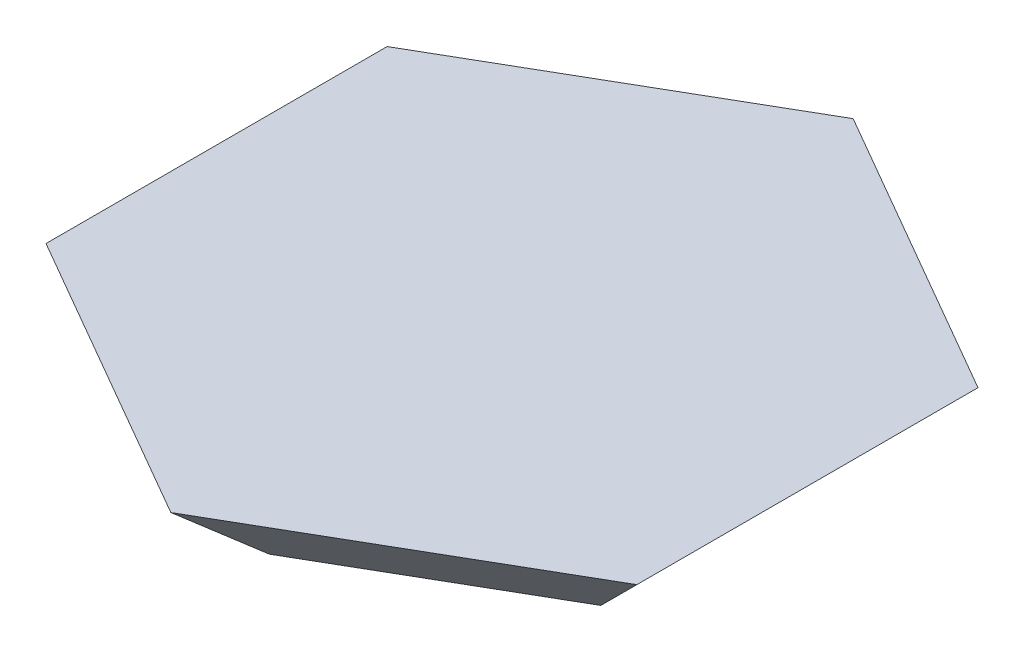
ISO-10303-21;
HEADER;
FILE_DESCRIPTION(('STEP AP214'),'2;1');
FILE_NAME('part.step','',(''),(''),'','','');
FILE_SCHEMA(('AUTOMOTIVE_DESIGN { 1 0 10303 214 1 1 1 1 }'));
ENDSEC;
DATA;
#1=APPLICATION_CONTEXT('core data for automotive mechanical design processes');
#2=APPLICATION_PROTOCOL_DEFINITION('international standard','automotive_design',2000,#1);
#3=PRODUCT_CONTEXT('',#1,'mechanical');
#4=PRODUCT('Part','Part','',(#3));
#5=PRODUCT_RELATED_PRODUCT_CATEGORY('part','',(#4));
#6=PRODUCT_DEFINITION_FORMATION('','',#4);
#7=PRODUCT_DEFINITION_CONTEXT('part definition',#1,'design');
#8=PRODUCT_DEFINITION('design','',#6,#7);
#9=PRODUCT_DEFINITION_SHAPE('','',#8);
#10=(LENGTH_UNIT() NAMED_UNIT(*) SI_UNIT(.MILLI.,.METRE.));
#11=(NAMED_UNIT(*) PLANE_ANGLE_UNIT() SI_UNIT($,.RADIAN.));
#12=(NAMED_UNIT(*) SI_UNIT($,.STERADIAN.) SOLID_ANGLE_UNIT());
#13=UNCERTAINTY_MEASURE_WITH_UNIT(LENGTH_MEASURE(1.E-05),#10,'distance_accuracy_value','');
#14=(GEOMETRIC_REPRESENTATION_CONTEXT(3) GLOBAL_UNCERTAINTY_ASSIGNED_CONTEXT((#13)) GLOBAL_UNIT_ASSIGNED_CONTEXT((#10,
#11,#12)) REPRESENTATION_CONTEXT('',''));
#15=CARTESIAN_POINT('',(0.,0.,0.));
#16=DIRECTION('',(0.,0.,1.));
#17=DIRECTION('',(1.,0.,0.));
#18=AXIS2_PLACEMENT_3D('',#15,#16,#17);
#19=CARTESIAN_POINT('',(0.,-130.,0.));
#20=DIRECTION('',(0.,1.,0.));
#21=DIRECTION('',(0.,0.,1.));
#22=AXIS2_PLACEMENT_3D('',#19,#20,#21);
#23=PLANE('',#22);
#24=DIRECTION('',(-0.866025403784442,0.,-0.499999999999995));
#25=VECTOR('',#24,1.);
#26=CARTESIAN_POINT('',(-88.9230484541322,-130.,34.0192378864669));
#27=LINE('',#26,#25);
#28=CARTESIAN_POINT('',(5.79741931923201E-13,-130.,85.358983848622));
#29=VERTEX_POINT('',#28);
#30=CARTESIAN_POINT('',(-73.923048454132,-130.,42.6794919243113));
#31=VERTEX_POINT('',#30);
#32=EDGE_CURVE('E177',#29,#31,#27,.T.);
#33=ORIENTED_EDGE('',*,*,#32,.T.);
#34=DIRECTION('',(0.,0.,-1.));
#35=VECTOR('',#34,1.);
#36=CARTESIAN_POINT('',(-73.9230484541324,-130.,-59.9999999999997));
#37=LINE('',#36,#35);
#38=CARTESIAN_POINT('',(-73.9230484541323,-130.,-42.6794919243108));
#39=VERTEX_POINT('',#38);
#40=EDGE_CURVE('E168',#31,#39,#37,.T.);
#41=ORIENTED_EDGE('',*,*,#40,.T.);
#42=DIRECTION('',(0.866025403784438,0.,-0.500000000000001));
#43=VECTOR('',#42,1.);
#44=CARTESIAN_POINT('',(15.0000000000001,-130.,-94.0192378864664));
#45=LINE('',#44,#43);
#46=CARTESIAN_POINT('',(1.49828066620117E-13,-130.,-85.358983848622));
#47=VERTEX_POINT('',#46);
#48=EDGE_CURVE('E196',#39,#47,#45,.T.);
#49=ORIENTED_EDGE('',*,*,#48,.T.);
#50=DIRECTION('',(0.866025403784441,0.,0.499999999999995));
#51=VECTOR('',#50,1.);
#52=CARTESIAN_POINT('',(88.9230484541318,-130.,-34.0192378864677));
#53=LINE('',#52,#51);
#54=CARTESIAN_POINT('',(73.9230484541317,-130.,-42.679491924312));
#55=VERTEX_POINT('',#54);
#56=EDGE_CURVE('E193',#47,#55,#53,.T.);
#57=ORIENTED_EDGE('',*,*,#56,.T.);
#58=DIRECTION('',(0.,0.,1.));
#59=VECTOR('',#58,1.);
#60=CARTESIAN_POINT('',(73.9230484541328,-130.,59.9999999999992));
#61=LINE('',#60,#59);
#62=CARTESIAN_POINT('',(73.9230484541326,-130.,42.6794919243103));
#63=VERTEX_POINT('',#62);
#64=EDGE_CURVE('E190',#55,#63,#61,.T.);
#65=ORIENTED_EDGE('',*,*,#64,.T.);
#66=DIRECTION('',(-0.866025403784435,0.,0.500000000000007));
#67=VECTOR('',#66,1.);
#68=CARTESIAN_POINT('',(-14.9999999999995,-130.,94.0192378864665));
#69=LINE('',#68,#67);
#70=EDGE_CURVE('E182',#63,#29,#69,.T.);
#71=ORIENTED_EDGE('',*,*,#70,.T.);
#72=EDGE_LOOP('',(#33,#41,#49,#57,#65,#71));
#73=FACE_BOUND('',#72,.T.);
#74=ADVANCED_FACE('F45',(#73),#23,.F.);
#75=CARTESIAN_POINT('',(103.923048454133,-99.9999999999998,59.9999999999989));
#76=DIRECTION('',(0.707106781186547,-0.707106781186548,0.));
#77=DIRECTION('',(0.,0.,1.));
#78=AXIS2_PLACEMENT_3D('',#75,#76,#77);
#79=PLANE('',#78);
#80=DIRECTION('',(0.654653670707981,0.654653670707977,0.377964473009221));
#81=VECTOR('',#80,1.);
#82=CARTESIAN_POINT('',(74.2307488958091,-129.692299558323,42.857142857142));
#83=LINE('',#82,#81);
#84=CARTESIAN_POINT('',(103.923048454133,-99.9999999999999,59.9999999999989));
#85=VERTEX_POINT('',#84);
#86=EDGE_CURVE('E185',#63,#85,#83,.T.);
#87=ORIENTED_EDGE('',*,*,#86,.F.);
#88=ORIENTED_EDGE('',*,*,#64,.F.);
#89=DIRECTION('',(0.654653670707974,0.654653670707978,-0.377964473009232));
#90=VECTOR('',#89,1.);
#91=CARTESIAN_POINT('',(74.2307488958084,-129.692299558323,-42.8571428571438));
#92=LINE('',#91,#90);
#93=CARTESIAN_POINT('',(103.923048454132,-99.9999999999998,-60.0000000000011));
#94=VERTEX_POINT('',#93);
#95=EDGE_CURVE('E178',#94,#55,#92,.F.);
#96=ORIENTED_EDGE('',*,*,#95,.F.);
#97=DIRECTION('',(0.,0.,-1.));
#98=VECTOR('',#97,1.);
#99=CARTESIAN_POINT('',(103.923048454132,-99.9999999999998,-60.0000000000011));
#100=LINE('',#99,#98);
#101=EDGE_CURVE('E119',#85,#94,#100,.T.);
#102=ORIENTED_EDGE('',*,*,#101,.F.);
#103=EDGE_LOOP('',(#87,#88,#96,#102));
#104=FACE_BOUND('',#103,.T.);
#105=ADVANCED_FACE('F308',(#104),#79,.T.);
#106=CARTESIAN_POINT('',(103.923048454132,-99.9999999999998,-60.0000000000011));
#107=DIRECTION('',(0.35355339059327,-0.707106781186547,-0.612372435695796));
#108=DIRECTION('',(0.866025403784442,0.,0.499999999999995));
#109=AXIS2_PLACEMENT_3D('',#106,#107,#108);
#110=PLANE('',#109);
#111=ORIENTED_EDGE('',*,*,#95,.T.);
#112=ORIENTED_EDGE('',*,*,#56,.F.);
#113=DIRECTION('',(0.,0.654653670707977,-0.755928946018454));
#114=VECTOR('',#113,1.);
#115=CARTESIAN_POINT('',(1.52655665885959E-13,-129.692299558323,-85.714285714286));
#116=LINE('',#115,#114);
#117=CARTESIAN_POINT('',(0.,-99.9999999999998,-120.));
#118=VERTEX_POINT('',#117);
#119=EDGE_CURVE('E214',#118,#47,#116,.F.);
#120=ORIENTED_EDGE('',*,*,#119,.F.);
#121=DIRECTION('',(-0.866025403784442,0.,-0.499999999999995));
#122=VECTOR('',#121,1.);
#123=CARTESIAN_POINT('',(0.,-99.9999999999998,-120.));
#124=LINE('',#123,#122);
#125=EDGE_CURVE('E203',#94,#118,#124,.T.);
#126=ORIENTED_EDGE('',*,*,#125,.F.);
#127=EDGE_LOOP('',(#111,#112,#120,#126));
#128=FACE_BOUND('',#127,.T.);
#129=ADVANCED_FACE('F379',(#128),#110,.T.);
#130=CARTESIAN_POINT('',(8.3795552132235E-13,-99.9999999999998,120.));
#131=DIRECTION('',(0.353553390593279,-0.707106781186548,0.612372435695791));
#132=DIRECTION('',(-0.866025403784435,0.,0.500000000000007));
#133=AXIS2_PLACEMENT_3D('',#130,#131,#132);
#134=PLANE('',#133);
#135=ORIENTED_EDGE('',*,*,#86,.T.);
#136=DIRECTION('',(0.866025403784435,0.,-0.500000000000007));
#137=VECTOR('',#136,1.);
#138=CARTESIAN_POINT('',(103.923048454133,-99.9999999999999,59.9999999999989));
#139=LINE('',#138,#137);
#140=CARTESIAN_POINT('',(8.3795552132235E-13,-99.9999999999998,120.));
#141=VERTEX_POINT('',#140);
#142=EDGE_CURVE('E111',#141,#85,#139,.T.);
#143=ORIENTED_EDGE('',*,*,#142,.F.);
#144=DIRECTION('',(0.,0.654653670707977,0.755928946018455));
#145=VECTOR('',#144,1.);
#146=CARTESIAN_POINT('',(5.82867087928207E-13,-129.692299558323,85.7142857142853));
#147=LINE('',#146,#145);
#148=EDGE_CURVE('E156',#29,#141,#147,.T.);
#149=ORIENTED_EDGE('',*,*,#148,.F.);
#150=ORIENTED_EDGE('',*,*,#70,.F.);
#151=EDGE_LOOP('',(#135,#143,#149,#150));
#152=FACE_BOUND('',#151,.T.);
#153=ADVANCED_FACE('F371',(#152),#134,.T.);
#154=CARTESIAN_POINT('',(0.,-99.9999999999998,-120.));
#155=DIRECTION('',(-0.353553390593274,-0.707106781186548,-0.612372435695794));
#156=DIRECTION('',(0.866025403784438,0.,-0.500000000000001));
#157=AXIS2_PLACEMENT_3D('',#154,#155,#156);
#158=PLANE('',#157);
#159=ORIENTED_EDGE('',*,*,#119,.T.);
#160=ORIENTED_EDGE('',*,*,#48,.F.);
#161=DIRECTION('',(-0.654653670707978,0.654653670707977,-0.377964473009226));
#162=VECTOR('',#161,1.);
#163=CARTESIAN_POINT('',(-74.2307488958089,-129.692299558323,-42.8571428571425));
#164=LINE('',#163,#162);
#165=CARTESIAN_POINT('',(-103.923048454133,-99.9999999999998,-59.9999999999996));
#166=VERTEX_POINT('',#165);
#167=EDGE_CURVE('E170',#166,#39,#164,.F.);
#168=ORIENTED_EDGE('',*,*,#167,.F.);
#169=DIRECTION('',(-0.866025403784438,0.,0.500000000000001));
#170=VECTOR('',#169,1.);
#171=CARTESIAN_POINT('',(-103.923048454133,-99.9999999999998,-59.9999999999996));
#172=LINE('',#171,#170);
#173=EDGE_CURVE('E175',#118,#166,#172,.T.);
#174=ORIENTED_EDGE('',*,*,#173,.F.);
#175=EDGE_LOOP('',(#159,#160,#168,#174));
#176=FACE_BOUND('',#175,.T.);
#177=ADVANCED_FACE('F364',(#176),#158,.T.);
#178=CARTESIAN_POINT('',(-103.923048454132,-99.9999999999998,60.0000000000003));
#179=DIRECTION('',(-0.35355339059327,-0.707106781186548,0.612372435695796));
#180=DIRECTION('',(-0.866025403784442,0.,-0.499999999999995));
#181=AXIS2_PLACEMENT_3D('',#178,#179,#180);
#182=PLANE('',#181);
#183=ORIENTED_EDGE('',*,*,#148,.T.);
#184=DIRECTION('',(0.866025403784442,0.,0.499999999999995));
#185=VECTOR('',#184,1.);
#186=CARTESIAN_POINT('',(8.36526585625329E-13,-99.9999999999998,120.));
#187=LINE('',#186,#185);
#188=CARTESIAN_POINT('',(-103.923048454132,-99.9999999999998,60.0000000000003));
#189=VERTEX_POINT('',#188);
#190=EDGE_CURVE('E151',#189,#141,#187,.T.);
#191=ORIENTED_EDGE('',*,*,#190,.F.);
#192=DIRECTION('',(0.654653670707976,-0.654653670707977,-0.37796447300923));
#193=VECTOR('',#192,1.);
#194=CARTESIAN_POINT('',(-103.923048454132,-99.9999999999998,60.0000000000003));
#195=LINE('',#194,#193);
#196=EDGE_CURVE('E155',#31,#189,#195,.F.);
#197=ORIENTED_EDGE('',*,*,#196,.F.);
#198=ORIENTED_EDGE('',*,*,#32,.F.);
#199=EDGE_LOOP('',(#183,#191,#197,#198));
#200=FACE_BOUND('',#199,.T.);
#201=ADVANCED_FACE('F153',(#200),#182,.T.);
#202=CARTESIAN_POINT('',(-103.923048454133,-99.9999999999998,-59.9999999999996));
#203=DIRECTION('',(-0.707106781186547,-0.707106781186548,0.));
#204=DIRECTION('',(0.,0.,-1.));
#205=AXIS2_PLACEMENT_3D('',#202,#203,#204);
#206=PLANE('',#205);
#207=ORIENTED_EDGE('',*,*,#167,.T.);
#208=ORIENTED_EDGE('',*,*,#40,.F.);
#209=ORIENTED_EDGE('',*,*,#196,.T.);
#210=DIRECTION('',(0.,0.,1.));
#211=VECTOR('',#210,1.);
#212=CARTESIAN_POINT('',(-103.923048454132,-99.9999999999998,60.0000000000004));
#213=LINE('',#212,#211);
#214=EDGE_CURVE('E165',#166,#189,#213,.T.);
#215=ORIENTED_EDGE('',*,*,#214,.F.);
#216=EDGE_LOOP('',(#207,#208,#209,#215));
#217=FACE_BOUND('',#216,.T.);
#218=ADVANCED_FACE('F164',(#217),#206,.T.);
#219=CARTESIAN_POINT('',(0.,-100.,0.));
#220=DIRECTION('',(0.,1.,0.));
#221=DIRECTION('',(0.,0.,1.));
#222=AXIS2_PLACEMENT_3D('',#219,#220,#221);
#223=PLANE('',#222);
#224=ORIENTED_EDGE('',*,*,#101,.T.);
#225=ORIENTED_EDGE('',*,*,#125,.T.);
#226=ORIENTED_EDGE('',*,*,#173,.T.);
#227=ORIENTED_EDGE('',*,*,#214,.T.);
#228=ORIENTED_EDGE('',*,*,#190,.T.);
#229=ORIENTED_EDGE('',*,*,#142,.T.);
#230=EDGE_LOOP('',(#224,#225,#226,#227,#228,#229));
#231=FACE_BOUND('',#230,.T.);
#232=ADVANCED_FACE('F172',(#231),#223,.T.);
#233=CLOSED_SHELL('',(#74,#105,#129,#153,#177,#201,#218,#232));
#234=CARTESIAN_POINT('',(0.,-120.,0.));
#235=DIRECTION('',(0.,1.,0.));
#236=DIRECTION('',(0.,0.,1.));
#237=AXIS2_PLACEMENT_3D('',#234,#235,#236);
#238=PLANE('',#237);
#239=DIRECTION('',(-0.866025403784441,0.,-0.499999999999995));
#240=VECTOR('',#239,1.);
#241=CARTESIAN_POINT('',(-86.8519806422668,-120.,30.4320432103954));
#242=LINE('',#241,#240);
#243=CARTESIAN_POINT('',(5.49695639948458E-13,-120.,80.57605761386));
#244=VERTEX_POINT('',#243);
#245=CARTESIAN_POINT('',(-69.7809128304011,-120.,40.2880288069303));
#246=VERTEX_POINT('',#245);
#247=EDGE_CURVE('E49',#244,#246,#242,.T.);
#248=ORIENTED_EDGE('',*,*,#247,.F.);
#249=DIRECTION('',(-0.866025403784434,0.,0.500000000000007));
#250=VECTOR('',#249,1.);
#251=CARTESIAN_POINT('',(-17.071067811865,-120.,90.4320432103951));
#252=LINE('',#251,#250);
#253=CARTESIAN_POINT('',(69.7809128304016,-120.,40.2880288069294));
#254=VERTEX_POINT('',#253);
#255=EDGE_CURVE('E259',#254,#244,#252,.T.);
#256=ORIENTED_EDGE('',*,*,#255,.F.);
#257=DIRECTION('',(0.,0.,1.));
#258=VECTOR('',#257,1.);
#259=CARTESIAN_POINT('',(69.7809128304018,-120.,59.9999999999993));
#260=LINE('',#259,#258);
#261=CARTESIAN_POINT('',(69.7809128304008,-120.,-40.288028806931));
#262=VERTEX_POINT('',#261);
#263=EDGE_CURVE('E262',#262,#254,#260,.T.);
#264=ORIENTED_EDGE('',*,*,#263,.F.);
#265=DIRECTION('',(0.866025403784441,0.,0.499999999999995));
#266=VECTOR('',#265,1.);
#267=CARTESIAN_POINT('',(86.8519806422663,-120.,-30.4320432103962));
#268=LINE('',#267,#266);
#269=CARTESIAN_POINT('',(1.65852755673314E-13,-120.,-80.5760576138601));
#270=VERTEX_POINT('',#269);
#271=EDGE_CURVE('E265',#270,#262,#268,.T.);
#272=ORIENTED_EDGE('',*,*,#271,.F.);
#273=DIRECTION('',(0.866025403784438,0.,-0.500000000000001));
#274=VECTOR('',#273,1.);
#275=CARTESIAN_POINT('',(17.0710678118656,-120.,-90.4320432103949));
#276=LINE('',#275,#274);
#277=CARTESIAN_POINT('',(-69.7809128304013,-120.,-40.2880288069298));
#278=VERTEX_POINT('',#277);
#279=EDGE_CURVE('E97',#278,#270,#276,.T.);
#280=ORIENTED_EDGE('',*,*,#279,.F.);
#281=DIRECTION('',(0.,0.,-1.));
#282=VECTOR('',#281,1.);
#283=CARTESIAN_POINT('',(-69.7809128304014,-120.,-59.9999999999997));
#284=LINE('',#283,#282);
#285=EDGE_CURVE('E269',#246,#278,#284,.T.);
#286=ORIENTED_EDGE('',*,*,#285,.F.);
#287=EDGE_LOOP('',(#248,#256,#264,#272,#280,#286));
#288=FACE_BOUND('',#287,.T.);
#289=ADVANCED_FACE('F278',(#288),#238,.T.);
#290=CARTESIAN_POINT('',(96.8519806422675,-92.9289321881344,59.999999999999));
#291=DIRECTION('',(0.707106781186547,-0.707106781186548,0.));
#292=DIRECTION('',(0.,0.,1.));
#293=AXIS2_PLACEMENT_3D('',#290,#291,#292);
#294=PLANE('',#293);
#295=DIRECTION('',(0.654653670707981,0.654653670707977,0.377964473009221));
#296=VECTOR('',#295,1.);
#297=CARTESIAN_POINT('',(68.1698336284958,-121.611079201906,39.3578717960232));
#298=LINE('',#297,#296);
#299=CARTESIAN_POINT('',(79.7809128304017,-110.,46.0615314988255));
#300=VERTEX_POINT('',#299);
#301=EDGE_CURVE('E251',#254,#300,#298,.T.);
#302=ORIENTED_EDGE('',*,*,#301,.T.);
#303=DIRECTION('',(0.,0.,-1.));
#304=VECTOR('',#303,1.);
#305=CARTESIAN_POINT('',(79.7809128304012,-110.,-8.30386934530538E-13));
#306=LINE('',#305,#304);
#307=CARTESIAN_POINT('',(79.7809128304007,-110.,-46.0615314988273));
#308=VERTEX_POINT('',#307);
#309=EDGE_CURVE('E234',#300,#308,#306,.T.);
#310=ORIENTED_EDGE('',*,*,#309,.T.);
#311=DIRECTION('',(-0.654653670707974,-0.654653670707977,0.377964473009232));
#312=VECTOR('',#311,1.);
#313=CARTESIAN_POINT('',(97.8621331868185,-91.9187796435822,-56.5007289388822));
#314=LINE('',#313,#312);
#315=EDGE_CURVE('E255',#308,#262,#314,.T.);
#316=ORIENTED_EDGE('',*,*,#315,.T.);
#317=ORIENTED_EDGE('',*,*,#263,.T.);
#318=EDGE_LOOP('',(#302,#310,#316,#317));
#319=FACE_BOUND('',#318,.T.);
#320=ADVANCED_FACE('F298',(#319),#294,.F.);
#321=CARTESIAN_POINT('',(100.387514548199,-92.9289321881344,-53.8762756430431));
#322=DIRECTION('',(0.35355339059327,-0.707106781186547,-0.612372435695796));
#323=DIRECTION('',(0.866025403784442,0.,0.499999999999995));
#324=AXIS2_PLACEMENT_3D('',#321,#322,#323);
#325=PLANE('',#324);
#326=ORIENTED_EDGE('',*,*,#315,.F.);
#327=DIRECTION('',(-0.866025403784441,0.,-0.499999999999995));
#328=VECTOR('',#327,1.);
#329=CARTESIAN_POINT('',(39.8904564152004,-110.,-69.0922972482399));
#330=LINE('',#329,#328);
#331=CARTESIAN_POINT('',(1.12172823372375E-13,-110.,-92.1230629976526));
#332=VERTEX_POINT('',#331);
#333=EDGE_CURVE('E230',#308,#332,#330,.T.);
#334=ORIENTED_EDGE('',*,*,#333,.T.);
#335=DIRECTION('',(0.,-0.654653670707977,0.755928946018454));
#336=VECTOR('',#335,1.);
#337=CARTESIAN_POINT('',(0.,-91.9187796435822,-113.001457877762));
#338=LINE('',#337,#336);
#339=EDGE_CURVE('E247',#332,#270,#338,.T.);
#340=ORIENTED_EDGE('',*,*,#339,.T.);
#341=ORIENTED_EDGE('',*,*,#271,.T.);
#342=EDGE_LOOP('',(#326,#334,#340,#341));
#343=FACE_BOUND('',#342,.T.);
#344=ADVANCED_FACE('F282',(#343),#325,.F.);
#345=CARTESIAN_POINT('',(-3.53553390593195,-92.9289321881344,113.876275643042));
#346=DIRECTION('',(0.353553390593279,-0.707106781186548,0.612372435695791));
#347=DIRECTION('',(-0.866025403784435,0.,0.500000000000007));
#348=AXIS2_PLACEMENT_3D('',#345,#346,#347);
#349=PLANE('',#348);
#350=ORIENTED_EDGE('',*,*,#301,.F.);
#351=ORIENTED_EDGE('',*,*,#255,.T.);
#352=DIRECTION('',(0.,0.654653670707977,0.755928946018455));
#353=VECTOR('',#352,1.);
#354=CARTESIAN_POINT('',(5.27355936696949E-13,-121.611079201906,78.7157435920477));
#355=LINE('',#354,#353);
#356=CARTESIAN_POINT('',(6.44457401005003E-13,-110.,92.1230629976525));
#357=VERTEX_POINT('',#356);
#358=EDGE_CURVE('E243',#244,#357,#355,.T.);
#359=ORIENTED_EDGE('',*,*,#358,.T.);
#360=DIRECTION('',(0.866025403784434,0.,-0.500000000000007));
#361=VECTOR('',#360,1.);
#362=CARTESIAN_POINT('',(39.8904564152012,-110.,69.092297248239));
#363=LINE('',#362,#361);
#364=EDGE_CURVE('E12',#357,#300,#363,.T.);
#365=ORIENTED_EDGE('',*,*,#364,.T.);
#366=EDGE_LOOP('',(#350,#351,#359,#365));
#367=FACE_BOUND('',#366,.T.);
#368=ADVANCED_FACE('F295',(#367),#349,.F.);
#369=CARTESIAN_POINT('',(3.53553390593274,-92.9289321881344,-113.876275643042));
#370=DIRECTION('',(-0.353553390593274,-0.707106781186548,-0.612372435695794));
#371=DIRECTION('',(0.866025403784438,0.,-0.500000000000001));
#372=AXIS2_PLACEMENT_3D('',#369,#370,#371);
#373=PLANE('',#372);
#374=ORIENTED_EDGE('',*,*,#339,.F.);
#375=DIRECTION('',(-0.866025403784438,0.,0.500000000000001));
#376=VECTOR('',#375,1.);
#377=CARTESIAN_POINT('',(-39.8904564152007,-110.,-69.0922972482393));
#378=LINE('',#377,#376);
#379=CARTESIAN_POINT('',(-79.7809128304014,-110.,-46.0615314988261));
#380=VERTEX_POINT('',#379);
#381=EDGE_CURVE('E227',#332,#380,#378,.T.);
#382=ORIENTED_EDGE('',*,*,#381,.T.);
#383=DIRECTION('',(0.654653670707978,-0.654653670707977,0.377964473009226));
#384=VECTOR('',#383,1.);
#385=CARTESIAN_POINT('',(-97.8621331868193,-91.9187796435822,-56.5007289388808));
#386=LINE('',#385,#384);
#387=EDGE_CURVE('E66',#380,#278,#386,.T.);
#388=ORIENTED_EDGE('',*,*,#387,.T.);
#389=ORIENTED_EDGE('',*,*,#279,.T.);
#390=EDGE_LOOP('',(#374,#382,#388,#389));
#391=FACE_BOUND('',#390,.T.);
#392=ADVANCED_FACE('F285',(#391),#373,.F.);
#393=CARTESIAN_POINT('',(-100.387514548199,-92.9289321881344,53.8762756430424));
#394=DIRECTION('',(-0.35355339059327,-0.707106781186548,0.612372435695796));
#395=DIRECTION('',(-0.866025403784442,0.,-0.499999999999995));
#396=AXIS2_PLACEMENT_3D('',#393,#394,#395);
#397=PLANE('',#396);
#398=ORIENTED_EDGE('',*,*,#358,.F.);
#399=ORIENTED_EDGE('',*,*,#247,.T.);
#400=DIRECTION('',(-0.654653670707976,0.654653670707977,0.37796447300923));
#401=VECTOR('',#400,1.);
#402=CARTESIAN_POINT('',(-68.1698336284953,-121.611079201906,39.3578717960242));
#403=LINE('',#402,#401);
#404=CARTESIAN_POINT('',(-79.7809128304011,-110.,46.0615314988266));
#405=VERTEX_POINT('',#404);
#406=EDGE_CURVE('E238',#246,#405,#403,.T.);
#407=ORIENTED_EDGE('',*,*,#406,.T.);
#408=DIRECTION('',(0.866025403784441,0.,0.499999999999995));
#409=VECTOR('',#408,1.);
#410=CARTESIAN_POINT('',(-39.8904564152002,-110.,69.0922972482396));
#411=LINE('',#410,#409);
#412=EDGE_CURVE('E57',#405,#357,#411,.T.);
#413=ORIENTED_EDGE('',*,*,#412,.T.);
#414=EDGE_LOOP('',(#398,#399,#407,#413));
#415=FACE_BOUND('',#414,.T.);
#416=ADVANCED_FACE('F287',(#415),#397,.F.);
#417=CARTESIAN_POINT('',(-96.8519806422671,-92.9289321881344,-59.9999999999997));
#418=DIRECTION('',(-0.707106781186547,-0.707106781186548,0.));
#419=DIRECTION('',(0.,0.,-1.));
#420=AXIS2_PLACEMENT_3D('',#417,#418,#419);
#421=PLANE('',#420);
#422=ORIENTED_EDGE('',*,*,#387,.F.);
#423=DIRECTION('',(0.,0.,1.));
#424=VECTOR('',#423,1.);
#425=CARTESIAN_POINT('',(-79.7809128304012,-110.,2.67569123348729E-13));
#426=LINE('',#425,#424);
#427=EDGE_CURVE('E223',#380,#405,#426,.T.);
#428=ORIENTED_EDGE('',*,*,#427,.T.);
#429=ORIENTED_EDGE('',*,*,#406,.F.);
#430=ORIENTED_EDGE('',*,*,#285,.T.);
#431=EDGE_LOOP('',(#422,#428,#429,#430));
#432=FACE_BOUND('',#431,.T.);
#433=ADVANCED_FACE('F275',(#432),#421,.F.);
#434=CARTESIAN_POINT('',(0.,-110.,0.));
#435=DIRECTION('',(0.,1.,0.));
#436=DIRECTION('',(0.,0.,1.));
#437=AXIS2_PLACEMENT_3D('',#434,#435,#436);
#438=PLANE('',#437);
#439=ORIENTED_EDGE('',*,*,#309,.F.);
#440=ORIENTED_EDGE('',*,*,#364,.F.);
#441=ORIENTED_EDGE('',*,*,#412,.F.);
#442=ORIENTED_EDGE('',*,*,#427,.F.);
#443=ORIENTED_EDGE('',*,*,#381,.F.);
#444=ORIENTED_EDGE('',*,*,#333,.F.);
#445=EDGE_LOOP('',(#439,#440,#441,#442,#443,#444));
#446=FACE_BOUND('',#445,.T.);
#447=ADVANCED_FACE('F47',(#446),#438,.F.);
#448=CLOSED_SHELL('',(#289,#320,#344,#368,#392,#416,#433,#447));
#449=ORIENTED_CLOSED_SHELL('',*,#448,.T.);
#450=BREP_WITH_VOIDS('B2',#233,(#449));
#451=ADVANCED_BREP_SHAPE_REPRESENTATION('',(#18,#450),#14);
#452=SHAPE_DEFINITION_REPRESENTATION(#9,#451);
ENDSEC;
END-ISO-10303-21;
